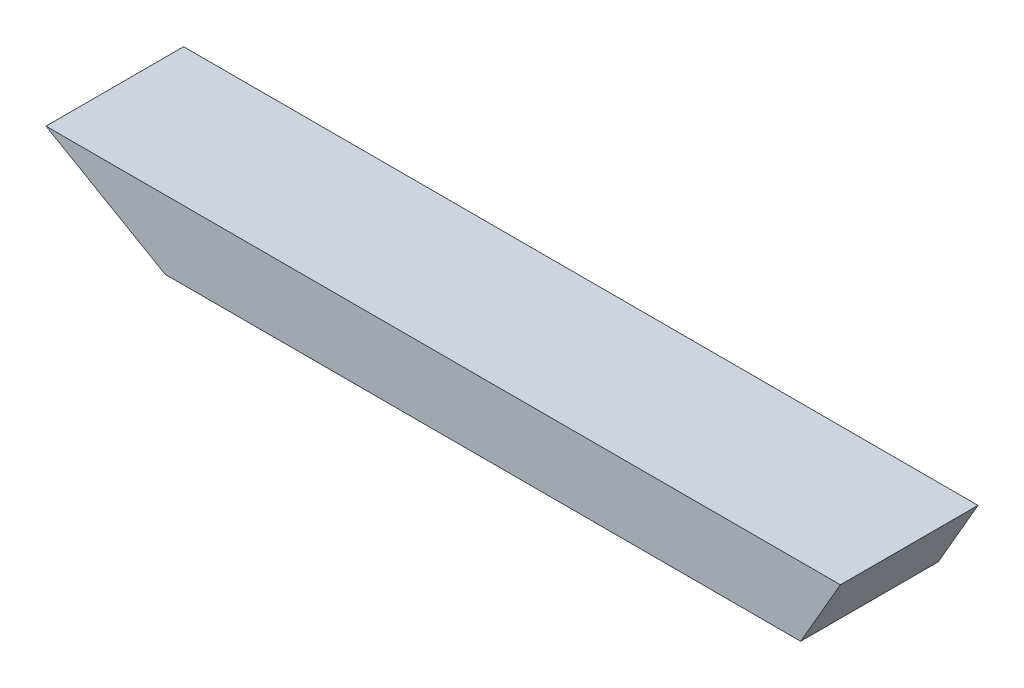
ISO-10303-21;
HEADER;
FILE_DESCRIPTION(('STEP AP214'),'2;1');
FILE_NAME('part.step','',(''),(''),'','','');
FILE_SCHEMA(('AUTOMOTIVE_DESIGN { 1 0 10303 214 1 1 1 1 }'));
ENDSEC;
DATA;
#1=APPLICATION_CONTEXT('core data for automotive mechanical design processes');
#2=APPLICATION_PROTOCOL_DEFINITION('international standard','automotive_design',2000,#1);
#3=PRODUCT_CONTEXT('',#1,'mechanical');
#4=PRODUCT('Part','Part','',(#3));
#5=PRODUCT_RELATED_PRODUCT_CATEGORY('part','',(#4));
#6=PRODUCT_DEFINITION_FORMATION('','',#4);
#7=PRODUCT_DEFINITION_CONTEXT('part definition',#1,'design');
#8=PRODUCT_DEFINITION('design','',#6,#7);
#9=PRODUCT_DEFINITION_SHAPE('','',#8);
#10=(LENGTH_UNIT() NAMED_UNIT(*) SI_UNIT(.MILLI.,.METRE.));
#11=(NAMED_UNIT(*) PLANE_ANGLE_UNIT() SI_UNIT($,.RADIAN.));
#12=(NAMED_UNIT(*) SI_UNIT($,.STERADIAN.) SOLID_ANGLE_UNIT());
#13=UNCERTAINTY_MEASURE_WITH_UNIT(LENGTH_MEASURE(1.E-05),#10,'distance_accuracy_value','');
#14=(GEOMETRIC_REPRESENTATION_CONTEXT(3) GLOBAL_UNCERTAINTY_ASSIGNED_CONTEXT((#13)) GLOBAL_UNIT_ASSIGNED_CONTEXT((#10,
#11,#12)) REPRESENTATION_CONTEXT('',''));
#15=CARTESIAN_POINT('',(0.,0.,0.));
#16=DIRECTION('',(0.,0.,1.));
#17=DIRECTION('',(1.,0.,0.));
#18=AXIS2_PLACEMENT_3D('',#15,#16,#17);
#19=CARTESIAN_POINT('',(-146.65,25.4,-25.4));
#20=DIRECTION('',(0.,0.,1.));
#21=DIRECTION('',(1.,0.,0.));
#22=AXIS2_PLACEMENT_3D('',#19,#20,#21);
#23=PLANE('',#22);
#24=DIRECTION('',(-1.,0.,0.));
#25=VECTOR('',#24,1.);
#26=CARTESIAN_POINT('',(-146.65,0.,-25.4));
#27=LINE('',#26,#25);
#28=CARTESIAN_POINT('',(131.985303162584,0.,-25.4));
#29=VERTEX_POINT('',#28);
#30=CARTESIAN_POINT('',(-102.655909487751,0.,-25.4));
#31=VERTEX_POINT('',#30);
#32=EDGE_CURVE('E93',#29,#31,#27,.T.);
#33=ORIENTED_EDGE('',*,*,#32,.T.);
#34=DIRECTION('',(0.866025403784436,-0.500000000000004,0.));
#35=VECTOR('',#34,1.);
#36=CARTESIAN_POINT('',(-146.65,25.4,-25.4));
#37=LINE('',#36,#35);
#38=CARTESIAN_POINT('',(-146.65,25.4,-25.4));
#39=VERTEX_POINT('',#38);
#40=EDGE_CURVE('E51',#39,#31,#37,.T.);
#41=ORIENTED_EDGE('',*,*,#40,.F.);
#42=DIRECTION('',(-1.,0.,0.));
#43=VECTOR('',#42,1.);
#44=CARTESIAN_POINT('',(-146.65,25.4,-25.4));
#45=LINE('',#44,#43);
#46=CARTESIAN_POINT('',(146.65,25.4,-25.4));
#47=VERTEX_POINT('',#46);
#48=EDGE_CURVE('E95',#47,#39,#45,.T.);
#49=ORIENTED_EDGE('',*,*,#48,.F.);
#50=DIRECTION('',(0.499999999999996,0.866025403784441,0.));
#51=VECTOR('',#50,1.);
#52=CARTESIAN_POINT('',(146.65,25.4,-25.4));
#53=LINE('',#52,#51);
#54=EDGE_CURVE('E88',#29,#47,#53,.T.);
#55=ORIENTED_EDGE('',*,*,#54,.F.);
#56=EDGE_LOOP('',(#33,#41,#49,#55));
#57=FACE_BOUND('',#56,.T.);
#58=ADVANCED_FACE('F35',(#57),#23,.F.);
#59=CARTESIAN_POINT('',(-146.65,25.4,25.4));
#60=DIRECTION('',(0.,0.,-1.));
#61=DIRECTION('',(-1.,0.,0.));
#62=AXIS2_PLACEMENT_3D('',#59,#60,#61);
#63=PLANE('',#62);
#64=DIRECTION('',(1.,0.,0.));
#65=VECTOR('',#64,1.);
#66=CARTESIAN_POINT('',(-146.65,25.4,25.4));
#67=LINE('',#66,#65);
#68=CARTESIAN_POINT('',(-146.65,25.4,25.4));
#69=VERTEX_POINT('',#68);
#70=CARTESIAN_POINT('',(146.65,25.4,25.4));
#71=VERTEX_POINT('',#70);
#72=EDGE_CURVE('E11',#69,#71,#67,.T.);
#73=ORIENTED_EDGE('',*,*,#72,.F.);
#74=DIRECTION('',(-0.866025403784436,0.500000000000004,0.));
#75=VECTOR('',#74,1.);
#76=CARTESIAN_POINT('',(-146.65,25.4,25.4));
#77=LINE('',#76,#75);
#78=CARTESIAN_POINT('',(-102.655909487751,0.,25.4));
#79=VERTEX_POINT('',#78);
#80=EDGE_CURVE('E77',#79,#69,#77,.T.);
#81=ORIENTED_EDGE('',*,*,#80,.F.);
#82=DIRECTION('',(1.,0.,0.));
#83=VECTOR('',#82,1.);
#84=CARTESIAN_POINT('',(-146.65,0.,25.4));
#85=LINE('',#84,#83);
#86=CARTESIAN_POINT('',(131.985303162584,0.,25.4));
#87=VERTEX_POINT('',#86);
#88=EDGE_CURVE('E38',#79,#87,#85,.T.);
#89=ORIENTED_EDGE('',*,*,#88,.T.);
#90=DIRECTION('',(-0.499999999999996,-0.866025403784441,0.));
#91=VECTOR('',#90,1.);
#92=CARTESIAN_POINT('',(146.65,25.4,25.4));
#93=LINE('',#92,#91);
#94=EDGE_CURVE('E59',#71,#87,#93,.T.);
#95=ORIENTED_EDGE('',*,*,#94,.F.);
#96=EDGE_LOOP('',(#73,#81,#89,#95));
#97=FACE_BOUND('',#96,.T.);
#98=ADVANCED_FACE('F87',(#97),#63,.F.);
#99=CARTESIAN_POINT('',(0.,25.4,0.));
#100=DIRECTION('',(0.,-1.,0.));
#101=DIRECTION('',(0.,0.,-1.));
#102=AXIS2_PLACEMENT_3D('',#99,#100,#101);
#103=PLANE('',#102);
#104=DIRECTION('',(0.,0.,-1.));
#105=VECTOR('',#104,1.);
#106=CARTESIAN_POINT('',(146.65,25.4,25.4));
#107=LINE('',#106,#105);
#108=EDGE_CURVE('E92',#71,#47,#107,.T.);
#109=ORIENTED_EDGE('',*,*,#108,.T.);
#110=ORIENTED_EDGE('',*,*,#48,.T.);
#111=DIRECTION('',(0.,0.,1.));
#112=VECTOR('',#111,1.);
#113=CARTESIAN_POINT('',(-146.65,25.4,25.4));
#114=LINE('',#113,#112);
#115=EDGE_CURVE('E43',#39,#69,#114,.T.);
#116=ORIENTED_EDGE('',*,*,#115,.T.);
#117=ORIENTED_EDGE('',*,*,#72,.T.);
#118=EDGE_LOOP('',(#109,#110,#116,#117));
#119=FACE_BOUND('',#118,.T.);
#120=ADVANCED_FACE('F109',(#119),#103,.F.);
#121=CARTESIAN_POINT('',(0.,0.,0.));
#122=DIRECTION('',(0.,-1.,0.));
#123=DIRECTION('',(0.,0.,-1.));
#124=AXIS2_PLACEMENT_3D('',#121,#122,#123);
#125=PLANE('',#124);
#126=DIRECTION('',(0.,0.,1.));
#127=VECTOR('',#126,1.);
#128=CARTESIAN_POINT('',(-102.655909487751,0.,-76.1999999999996));
#129=LINE('',#128,#127);
#130=EDGE_CURVE('E74',#31,#79,#129,.T.);
#131=ORIENTED_EDGE('',*,*,#130,.F.);
#132=ORIENTED_EDGE('',*,*,#32,.F.);
#133=DIRECTION('',(0.,0.,1.));
#134=VECTOR('',#133,1.);
#135=CARTESIAN_POINT('',(131.985303162584,0.,-76.1999999999996));
#136=LINE('',#135,#134);
#137=EDGE_CURVE('E91',#29,#87,#136,.T.);
#138=ORIENTED_EDGE('',*,*,#137,.T.);
#139=ORIENTED_EDGE('',*,*,#88,.F.);
#140=EDGE_LOOP('',(#131,#132,#138,#139));
#141=FACE_BOUND('',#140,.T.);
#142=ADVANCED_FACE('F90',(#141),#125,.T.);
#143=CARTESIAN_POINT('',(146.65,25.4,-76.1999999999996));
#144=DIRECTION('',(-0.866025403784441,0.499999999999996,0.));
#145=DIRECTION('',(-0.499999999999996,-0.866025403784441,0.));
#146=AXIS2_PLACEMENT_3D('',#143,#144,#145);
#147=PLANE('',#146);
#148=ORIENTED_EDGE('',*,*,#54,.T.);
#149=ORIENTED_EDGE('',*,*,#108,.F.);
#150=ORIENTED_EDGE('',*,*,#94,.T.);
#151=ORIENTED_EDGE('',*,*,#137,.F.);
#152=EDGE_LOOP('',(#148,#149,#150,#151));
#153=FACE_BOUND('',#152,.T.);
#154=ADVANCED_FACE('F107',(#153),#147,.F.);
#155=CARTESIAN_POINT('',(-146.65,25.4,-76.1999999999996));
#156=DIRECTION('',(0.500000000000004,0.866025403784436,0.));
#157=DIRECTION('',(-0.866025403784436,0.500000000000004,0.));
#158=AXIS2_PLACEMENT_3D('',#155,#156,#157);
#159=PLANE('',#158);
#160=ORIENTED_EDGE('',*,*,#40,.T.);
#161=ORIENTED_EDGE('',*,*,#130,.T.);
#162=ORIENTED_EDGE('',*,*,#80,.T.);
#163=ORIENTED_EDGE('',*,*,#115,.F.);
#164=EDGE_LOOP('',(#160,#161,#162,#163));
#165=FACE_BOUND('',#164,.T.);
#166=ADVANCED_FACE('F76',(#165),#159,.F.);
#167=CLOSED_SHELL('',(#58,#98,#120,#142,#154,#166));
#168=MANIFOLD_SOLID_BREP('B2',#167);
#169=ADVANCED_BREP_SHAPE_REPRESENTATION('',(#18,#168),#14);
#170=SHAPE_DEFINITION_REPRESENTATION(#9,#169);
ENDSEC;
END-ISO-10303-21;
